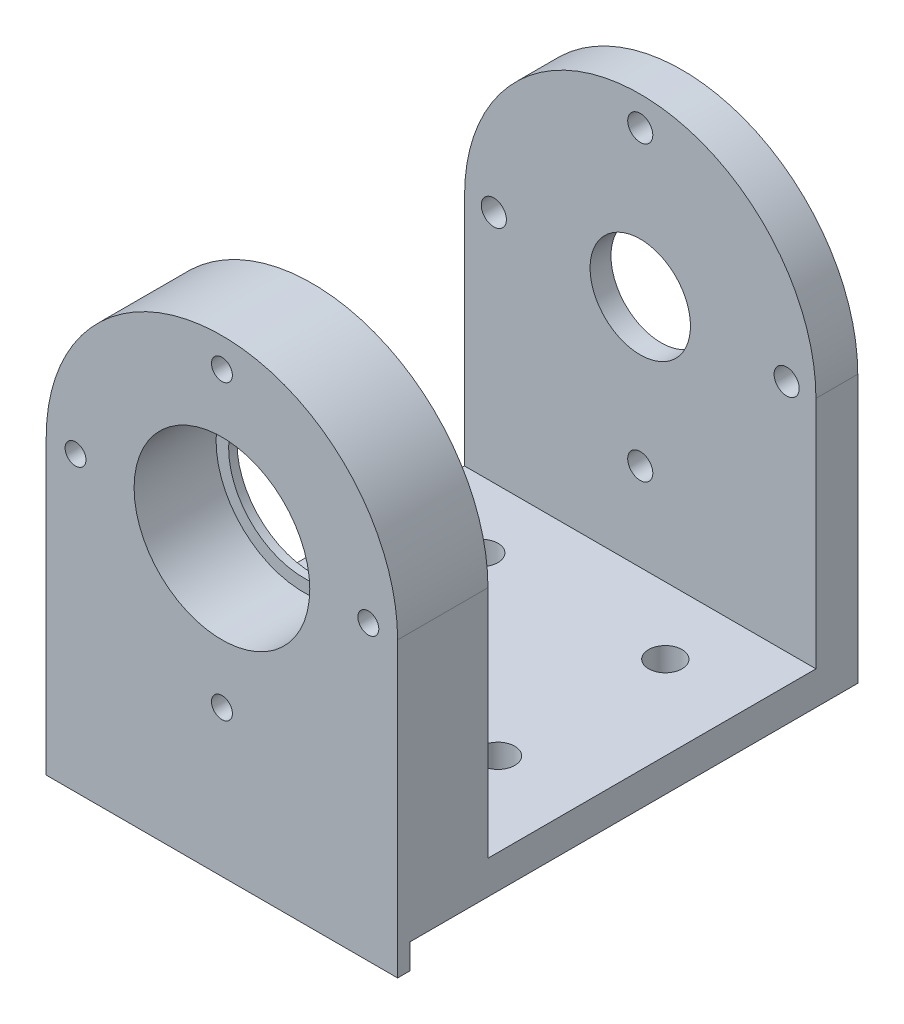
ISO-10303-21;
HEADER;
FILE_DESCRIPTION(('STEP AP214'),'2;1');
FILE_NAME('part.step','',(''),(''),'','','');
FILE_SCHEMA(('AUTOMOTIVE_DESIGN { 1 0 10303 214 1 1 1 1 }'));
ENDSEC;
DATA;
#1=APPLICATION_CONTEXT('core data for automotive mechanical design processes');
#2=APPLICATION_PROTOCOL_DEFINITION('international standard','automotive_design',2000,#1);
#3=PRODUCT_CONTEXT('',#1,'mechanical');
#4=PRODUCT('Part','Part','',(#3));
#5=PRODUCT_RELATED_PRODUCT_CATEGORY('part','',(#4));
#6=PRODUCT_DEFINITION_FORMATION('','',#4);
#7=PRODUCT_DEFINITION_CONTEXT('part definition',#1,'design');
#8=PRODUCT_DEFINITION('design','',#6,#7);
#9=PRODUCT_DEFINITION_SHAPE('','',#8);
#10=(LENGTH_UNIT() NAMED_UNIT(*) SI_UNIT(.MILLI.,.METRE.));
#11=(NAMED_UNIT(*) PLANE_ANGLE_UNIT() SI_UNIT($,.RADIAN.));
#12=(NAMED_UNIT(*) SI_UNIT($,.STERADIAN.) SOLID_ANGLE_UNIT());
#13=UNCERTAINTY_MEASURE_WITH_UNIT(LENGTH_MEASURE(1.E-05),#10,'distance_accuracy_value','');
#14=(GEOMETRIC_REPRESENTATION_CONTEXT(3) GLOBAL_UNCERTAINTY_ASSIGNED_CONTEXT((#13)) GLOBAL_UNIT_ASSIGNED_CONTEXT((#10,
#11,#12)) REPRESENTATION_CONTEXT('',''));
#15=CARTESIAN_POINT('',(0.,0.,0.));
#16=DIRECTION('',(0.,0.,1.));
#17=DIRECTION('',(1.,0.,0.));
#18=AXIS2_PLACEMENT_3D('',#15,#16,#17);
#19=CARTESIAN_POINT('',(0.,0.,-9.8));
#20=DIRECTION('',(0.,0.,-1.));
#21=DIRECTION('',(-1.,0.,0.));
#22=AXIS2_PLACEMENT_3D('',#19,#20,#21);
#23=PLANE('',#22);
#24=CARTESIAN_POINT('',(0.,0.,-9.8));
#25=DIRECTION('',(0.,0.,1.));
#26=DIRECTION('',(1.,0.,0.));
#27=AXIS2_PLACEMENT_3D('',#24,#25,#26);
#28=CIRCLE('',#27,10.5);
#29=CARTESIAN_POINT('',(10.5,0.,-9.8));
#30=VERTEX_POINT('',#29);
#31=EDGE_CURVE('E21',#30,#30,#28,.T.);
#32=ORIENTED_EDGE('',*,*,#31,.T.);
#33=EDGE_LOOP('',(#32));
#34=FACE_BOUND('',#33,.T.);
#35=CARTESIAN_POINT('',(0.,0.,-9.8));
#36=DIRECTION('',(0.,0.,-1.));
#37=DIRECTION('',(-1.,0.,0.));
#38=AXIS2_PLACEMENT_3D('',#35,#36,#37);
#39=CIRCLE('',#38,9.);
#40=CARTESIAN_POINT('',(-9.,0.,-9.8));
#41=VERTEX_POINT('',#40);
#42=EDGE_CURVE('E274',#41,#41,#39,.T.);
#43=ORIENTED_EDGE('',*,*,#42,.T.);
#44=EDGE_LOOP('',(#43));
#45=FACE_BOUND('',#44,.T.);
#46=ADVANCED_FACE('F18',(#34,#45),#23,.F.);
#47=CARTESIAN_POINT('',(0.,0.,-45.));
#48=DIRECTION('',(0.,0.,-1.));
#49=DIRECTION('',(-1.,0.,0.));
#50=AXIS2_PLACEMENT_3D('',#47,#48,#49);
#51=CYLINDRICAL_SURFACE('',#50,6.);
#52=CARTESIAN_POINT('',(0.,0.,-50.));
#53=DIRECTION('',(0.,0.,-1.));
#54=DIRECTION('',(-1.,0.,0.));
#55=AXIS2_PLACEMENT_3D('',#52,#53,#54);
#56=CIRCLE('',#55,6.);
#57=CARTESIAN_POINT('',(-6.,0.,-50.));
#58=VERTEX_POINT('',#57);
#59=EDGE_CURVE('E172',#58,#58,#56,.F.);
#60=ORIENTED_EDGE('',*,*,#59,.T.);
#61=EDGE_LOOP('',(#60));
#62=FACE_BOUND('',#61,.T.);
#63=CARTESIAN_POINT('',(0.,0.,-52.5));
#64=DIRECTION('',(0.,0.,-1.));
#65=DIRECTION('',(-1.,0.,0.));
#66=AXIS2_PLACEMENT_3D('',#63,#64,#65);
#67=CIRCLE('',#66,6.);
#68=CARTESIAN_POINT('',(-6.,0.,-52.5));
#69=VERTEX_POINT('',#68);
#70=EDGE_CURVE('E173',#69,#69,#67,.F.);
#71=ORIENTED_EDGE('',*,*,#70,.F.);
#72=EDGE_LOOP('',(#71));
#73=FACE_BOUND('',#72,.T.);
#74=ADVANCED_FACE('F285',(#62,#73),#51,.F.);
#75=CARTESIAN_POINT('',(0.,0.,-11.));
#76=DIRECTION('',(0.,0.,1.));
#77=DIRECTION('',(1.,0.,0.));
#78=AXIS2_PLACEMENT_3D('',#75,#76,#77);
#79=CYLINDRICAL_SURFACE('',#78,10.5);
#80=CARTESIAN_POINT('',(0.,0.,0.));
#81=DIRECTION('',(0.,0.,1.));
#82=DIRECTION('',(1.,0.,0.));
#83=AXIS2_PLACEMENT_3D('',#80,#81,#82);
#84=CIRCLE('',#83,10.5);
#85=CARTESIAN_POINT('',(10.5,0.,0.));
#86=VERTEX_POINT('',#85);
#87=EDGE_CURVE('E127',#86,#86,#84,.F.);
#88=ORIENTED_EDGE('',*,*,#87,.F.);
#89=EDGE_LOOP('',(#88));
#90=FACE_BOUND('',#89,.T.);
#91=ORIENTED_EDGE('',*,*,#31,.F.);
#92=EDGE_LOOP('',(#91));
#93=FACE_BOUND('',#92,.T.);
#94=ADVANCED_FACE('F282',(#90,#93),#79,.F.);
#95=CARTESIAN_POINT('',(0.,17.5,-10.8));
#96=DIRECTION('',(0.,0.,-1.));
#97=DIRECTION('',(-1.,0.,0.));
#98=AXIS2_PLACEMENT_3D('',#95,#96,#97);
#99=CYLINDRICAL_SURFACE('',#98,1.24999999999999);
#100=CARTESIAN_POINT('',(0.,17.5,0.));
#101=DIRECTION('',(0.,0.,-1.));
#102=DIRECTION('',(-1.,0.,0.));
#103=AXIS2_PLACEMENT_3D('',#100,#101,#102);
#104=CIRCLE('',#103,1.24999999999999);
#105=CARTESIAN_POINT('',(-1.24999999999999,17.5,0.));
#106=VERTEX_POINT('',#105);
#107=EDGE_CURVE('E268',#106,#106,#104,.T.);
#108=ORIENTED_EDGE('',*,*,#107,.F.);
#109=EDGE_LOOP('',(#108));
#110=FACE_BOUND('',#109,.T.);
#111=CARTESIAN_POINT('',(0.,17.5,-10.8));
#112=DIRECTION('',(0.,0.,-1.));
#113=DIRECTION('',(-1.,0.,0.));
#114=AXIS2_PLACEMENT_3D('',#111,#112,#113);
#115=CIRCLE('',#114,1.24999999999999);
#116=CARTESIAN_POINT('',(-1.24999999999999,17.5,-10.8));
#117=VERTEX_POINT('',#116);
#118=EDGE_CURVE('E100',#117,#117,#115,.T.);
#119=ORIENTED_EDGE('',*,*,#118,.T.);
#120=EDGE_LOOP('',(#119));
#121=FACE_BOUND('',#120,.T.);
#122=ADVANCED_FACE('F284',(#110,#121),#99,.F.);
#123=CARTESIAN_POINT('',(17.5,0.,-10.8));
#124=DIRECTION('',(0.,0.,-1.));
#125=DIRECTION('',(-1.,0.,0.));
#126=AXIS2_PLACEMENT_3D('',#123,#124,#125);
#127=CYLINDRICAL_SURFACE('',#126,1.24999999999999);
#128=CARTESIAN_POINT('',(17.5,0.,0.));
#129=DIRECTION('',(0.,0.,-1.));
#130=DIRECTION('',(-1.,0.,0.));
#131=AXIS2_PLACEMENT_3D('',#128,#129,#130);
#132=CIRCLE('',#131,1.24999999999999);
#133=CARTESIAN_POINT('',(16.25,0.,0.));
#134=VERTEX_POINT('',#133);
#135=EDGE_CURVE('E265',#134,#134,#132,.T.);
#136=ORIENTED_EDGE('',*,*,#135,.F.);
#137=EDGE_LOOP('',(#136));
#138=FACE_BOUND('',#137,.T.);
#139=CARTESIAN_POINT('',(17.5,0.,-10.8));
#140=DIRECTION('',(0.,0.,-1.));
#141=DIRECTION('',(-1.,0.,0.));
#142=AXIS2_PLACEMENT_3D('',#139,#140,#141);
#143=CIRCLE('',#142,1.24999999999999);
#144=CARTESIAN_POINT('',(16.25,0.,-10.8));
#145=VERTEX_POINT('',#144);
#146=EDGE_CURVE('E254',#145,#145,#143,.T.);
#147=ORIENTED_EDGE('',*,*,#146,.T.);
#148=EDGE_LOOP('',(#147));
#149=FACE_BOUND('',#148,.T.);
#150=ADVANCED_FACE('F293',(#138,#149),#127,.F.);
#151=CARTESIAN_POINT('',(-17.5,0.,-10.8));
#152=DIRECTION('',(0.,0.,-1.));
#153=DIRECTION('',(-1.,0.,0.));
#154=AXIS2_PLACEMENT_3D('',#151,#152,#153);
#155=CYLINDRICAL_SURFACE('',#154,1.24999999999999);
#156=CARTESIAN_POINT('',(-17.5,0.,0.));
#157=DIRECTION('',(0.,0.,-1.));
#158=DIRECTION('',(-1.,0.,0.));
#159=AXIS2_PLACEMENT_3D('',#156,#157,#158);
#160=CIRCLE('',#159,1.24999999999999);
#161=CARTESIAN_POINT('',(-18.75,0.,0.));
#162=VERTEX_POINT('',#161);
#163=EDGE_CURVE('E128',#162,#162,#160,.T.);
#164=ORIENTED_EDGE('',*,*,#163,.F.);
#165=EDGE_LOOP('',(#164));
#166=FACE_BOUND('',#165,.T.);
#167=CARTESIAN_POINT('',(-17.5,0.,-10.8));
#168=DIRECTION('',(0.,0.,-1.));
#169=DIRECTION('',(-1.,0.,0.));
#170=AXIS2_PLACEMENT_3D('',#167,#168,#169);
#171=CIRCLE('',#170,1.24999999999999);
#172=CARTESIAN_POINT('',(-18.75,0.,-10.8));
#173=VERTEX_POINT('',#172);
#174=EDGE_CURVE('E251',#173,#173,#171,.T.);
#175=ORIENTED_EDGE('',*,*,#174,.T.);
#176=EDGE_LOOP('',(#175));
#177=FACE_BOUND('',#176,.T.);
#178=ADVANCED_FACE('F393',(#166,#177),#155,.F.);
#179=CARTESIAN_POINT('',(0.,-17.5,-10.8));
#180=DIRECTION('',(0.,0.,-1.));
#181=DIRECTION('',(-1.,0.,0.));
#182=AXIS2_PLACEMENT_3D('',#179,#180,#181);
#183=CYLINDRICAL_SURFACE('',#182,1.24999999999999);
#184=CARTESIAN_POINT('',(0.,-17.5,0.));
#185=DIRECTION('',(0.,0.,-1.));
#186=DIRECTION('',(-1.,0.,0.));
#187=AXIS2_PLACEMENT_3D('',#184,#185,#186);
#188=CIRCLE('',#187,1.24999999999999);
#189=CARTESIAN_POINT('',(-1.24999999999999,-17.5,0.));
#190=VERTEX_POINT('',#189);
#191=EDGE_CURVE('E101',#190,#190,#188,.T.);
#192=ORIENTED_EDGE('',*,*,#191,.F.);
#193=EDGE_LOOP('',(#192));
#194=FACE_BOUND('',#193,.T.);
#195=CARTESIAN_POINT('',(0.,-17.5,-10.8));
#196=DIRECTION('',(0.,0.,-1.));
#197=DIRECTION('',(-1.,0.,0.));
#198=AXIS2_PLACEMENT_3D('',#195,#196,#197);
#199=CIRCLE('',#198,1.24999999999999);
#200=CARTESIAN_POINT('',(-1.24999999999999,-17.5,-10.8));
#201=VERTEX_POINT('',#200);
#202=EDGE_CURVE('E248',#201,#201,#199,.T.);
#203=ORIENTED_EDGE('',*,*,#202,.T.);
#204=EDGE_LOOP('',(#203));
#205=FACE_BOUND('',#204,.T.);
#206=ADVANCED_FACE('F389',(#194,#205),#183,.F.);
#207=CARTESIAN_POINT('',(0.,0.,-9.8));
#208=DIRECTION('',(0.,0.,-1.));
#209=DIRECTION('',(-1.,0.,0.));
#210=AXIS2_PLACEMENT_3D('',#207,#208,#209);
#211=CYLINDRICAL_SURFACE('',#210,9.);
#212=ORIENTED_EDGE('',*,*,#42,.F.);
#213=EDGE_LOOP('',(#212));
#214=FACE_BOUND('',#213,.T.);
#215=CARTESIAN_POINT('',(0.,0.,-10.8));
#216=DIRECTION('',(0.,0.,-1.));
#217=DIRECTION('',(-1.,0.,0.));
#218=AXIS2_PLACEMENT_3D('',#215,#216,#217);
#219=CIRCLE('',#218,9.);
#220=CARTESIAN_POINT('',(-9.,0.,-10.8));
#221=VERTEX_POINT('',#220);
#222=EDGE_CURVE('E244',#221,#221,#219,.T.);
#223=ORIENTED_EDGE('',*,*,#222,.T.);
#224=EDGE_LOOP('',(#223));
#225=FACE_BOUND('',#224,.T.);
#226=ADVANCED_FACE('F385',(#214,#225),#211,.F.);
#227=CARTESIAN_POINT('',(0.,0.,-52.5));
#228=DIRECTION('',(0.,0.,-1.));
#229=DIRECTION('',(-1.,0.,0.));
#230=AXIS2_PLACEMENT_3D('',#227,#228,#229);
#231=PLANE('',#230);
#232=ORIENTED_EDGE('',*,*,#70,.T.);
#233=EDGE_LOOP('',(#232));
#234=FACE_BOUND('',#233,.T.);
#235=CARTESIAN_POINT('',(0.,0.,-52.5));
#236=DIRECTION('',(0.,0.,-1.));
#237=DIRECTION('',(-1.,0.,0.));
#238=AXIS2_PLACEMENT_3D('',#235,#236,#237);
#239=CIRCLE('',#238,14.);
#240=CARTESIAN_POINT('',(-14.,0.,-52.5));
#241=VERTEX_POINT('',#240);
#242=EDGE_CURVE('E140',#241,#241,#239,.T.);
#243=ORIENTED_EDGE('',*,*,#242,.T.);
#244=EDGE_LOOP('',(#243));
#245=FACE_BOUND('',#244,.T.);
#246=ADVANCED_FACE('F381',(#234,#245),#231,.T.);
#247=CARTESIAN_POINT('',(-21.,-35.,-1.5));
#248=DIRECTION('',(0.,-1.,0.));
#249=DIRECTION('',(0.,0.,-1.));
#250=AXIS2_PLACEMENT_3D('',#247,#248,#249);
#251=PLANE('',#250);
#252=DIRECTION('',(1.,0.,0.));
#253=VECTOR('',#252,1.);
#254=CARTESIAN_POINT('',(0.,-35.,-1.5));
#255=LINE('',#254,#253);
#256=CARTESIAN_POINT('',(-21.,-35.,-1.5));
#257=VERTEX_POINT('',#256);
#258=CARTESIAN_POINT('',(21.,-35.,-1.5));
#259=VERTEX_POINT('',#258);
#260=EDGE_CURVE('E176',#257,#259,#255,.T.);
#261=ORIENTED_EDGE('',*,*,#260,.T.);
#262=DIRECTION('',(0.,0.,-1.));
#263=VECTOR('',#262,1.);
#264=CARTESIAN_POINT('',(21.,-35.,-55.));
#265=LINE('',#264,#263);
#266=CARTESIAN_POINT('',(21.,-35.,0.));
#267=VERTEX_POINT('',#266);
#268=EDGE_CURVE('E155',#267,#259,#265,.T.);
#269=ORIENTED_EDGE('',*,*,#268,.F.);
#270=DIRECTION('',(1.,0.,0.));
#271=VECTOR('',#270,1.);
#272=CARTESIAN_POINT('',(0.,-35.,0.));
#273=LINE('',#272,#271);
#274=CARTESIAN_POINT('',(-21.,-35.,0.));
#275=VERTEX_POINT('',#274);
#276=EDGE_CURVE('E125',#275,#267,#273,.T.);
#277=ORIENTED_EDGE('',*,*,#276,.F.);
#278=DIRECTION('',(0.,0.,-1.));
#279=VECTOR('',#278,1.);
#280=CARTESIAN_POINT('',(-21.,-35.,-1.5));
#281=LINE('',#280,#279);
#282=EDGE_CURVE('E113',#275,#257,#281,.T.);
#283=ORIENTED_EDGE('',*,*,#282,.T.);
#284=EDGE_LOOP('',(#261,#269,#277,#283));
#285=FACE_BOUND('',#284,.T.);
#286=ADVANCED_FACE('F377',(#285),#251,.T.);
#287=CARTESIAN_POINT('',(-21.,-28.,-50.));
#288=DIRECTION('',(0.,0.,-1.));
#289=DIRECTION('',(-1.,0.,0.));
#290=AXIS2_PLACEMENT_3D('',#287,#288,#289);
#291=PLANE('',#290);
#292=DIRECTION('',(0.,1.,0.));
#293=VECTOR('',#292,1.);
#294=CARTESIAN_POINT('',(-21.,0.,-50.));
#295=LINE('',#294,#293);
#296=CARTESIAN_POINT('',(-21.,-28.,-50.));
#297=VERTEX_POINT('',#296);
#298=CARTESIAN_POINT('',(-21.,0.,-50.));
#299=VERTEX_POINT('',#298);
#300=EDGE_CURVE('E131',#297,#299,#295,.T.);
#301=ORIENTED_EDGE('',*,*,#300,.F.);
#302=DIRECTION('',(1.,0.,0.));
#303=VECTOR('',#302,1.);
#304=CARTESIAN_POINT('',(0.,-28.,-50.));
#305=LINE('',#304,#303);
#306=CARTESIAN_POINT('',(21.,-28.,-50.));
#307=VERTEX_POINT('',#306);
#308=EDGE_CURVE('E137',#307,#297,#305,.F.);
#309=ORIENTED_EDGE('',*,*,#308,.F.);
#310=DIRECTION('',(0.,1.,0.));
#311=VECTOR('',#310,1.);
#312=CARTESIAN_POINT('',(21.,-32.,-50.));
#313=LINE('',#312,#311);
#314=CARTESIAN_POINT('',(21.,0.,-50.));
#315=VERTEX_POINT('',#314);
#316=EDGE_CURVE('E144',#315,#307,#313,.F.);
#317=ORIENTED_EDGE('',*,*,#316,.F.);
#318=CARTESIAN_POINT('',(0.,0.,-50.));
#319=DIRECTION('',(0.,0.,1.));
#320=DIRECTION('',(1.,0.,0.));
#321=AXIS2_PLACEMENT_3D('',#318,#319,#320);
#322=CIRCLE('',#321,21.);
#323=EDGE_CURVE('E227',#299,#315,#322,.F.);
#324=ORIENTED_EDGE('',*,*,#323,.F.);
#325=EDGE_LOOP('',(#301,#309,#317,#324));
#326=FACE_BOUND('',#325,.T.);
#327=ORIENTED_EDGE('',*,*,#59,.F.);
#328=EDGE_LOOP('',(#327));
#329=FACE_BOUND('',#328,.T.);
#330=CARTESIAN_POINT('',(0.,17.5,-50.));
#331=DIRECTION('',(0.,0.,-1.));
#332=DIRECTION('',(-1.,0.,0.));
#333=AXIS2_PLACEMENT_3D('',#330,#331,#332);
#334=CIRCLE('',#333,1.5);
#335=CARTESIAN_POINT('',(-1.5,17.5,-50.));
#336=VERTEX_POINT('',#335);
#337=EDGE_CURVE('E230',#336,#336,#334,.T.);
#338=ORIENTED_EDGE('',*,*,#337,.T.);
#339=EDGE_LOOP('',(#338));
#340=FACE_BOUND('',#339,.T.);
#341=CARTESIAN_POINT('',(-17.5000000000005,4.95236783133562E-13,-50.));
#342=DIRECTION('',(0.,0.,-1.));
#343=DIRECTION('',(-1.,0.,0.));
#344=AXIS2_PLACEMENT_3D('',#341,#342,#343);
#345=CIRCLE('',#344,1.50000000000039);
#346=CARTESIAN_POINT('',(-19.0000000000009,4.95236783133562E-13,-50.));
#347=VERTEX_POINT('',#346);
#348=EDGE_CURVE('E233',#347,#347,#345,.T.);
#349=ORIENTED_EDGE('',*,*,#348,.T.);
#350=EDGE_LOOP('',(#349));
#351=FACE_BOUND('',#350,.T.);
#352=CARTESIAN_POINT('',(-9.90473566267125E-13,-17.5,-50.));
#353=DIRECTION('',(0.,0.,-1.));
#354=DIRECTION('',(-1.,0.,0.));
#355=AXIS2_PLACEMENT_3D('',#352,#353,#354);
#356=CIRCLE('',#355,1.50000000000107);
#357=CARTESIAN_POINT('',(-1.50000000000206,-17.5,-50.));
#358=VERTEX_POINT('',#357);
#359=EDGE_CURVE('E236',#358,#358,#356,.T.);
#360=ORIENTED_EDGE('',*,*,#359,.T.);
#361=EDGE_LOOP('',(#360));
#362=FACE_BOUND('',#361,.T.);
#363=CARTESIAN_POINT('',(17.4999999999995,-4.9737991503207E-13,-50.));
#364=DIRECTION('',(0.,0.,-1.));
#365=DIRECTION('',(-1.,0.,0.));
#366=AXIS2_PLACEMENT_3D('',#363,#364,#365);
#367=CIRCLE('',#366,1.5000000000008);
#368=CARTESIAN_POINT('',(15.9999999999987,-4.9737991503207E-13,-50.));
#369=VERTEX_POINT('',#368);
#370=EDGE_CURVE('E239',#369,#369,#367,.T.);
#371=ORIENTED_EDGE('',*,*,#370,.T.);
#372=EDGE_LOOP('',(#371));
#373=FACE_BOUND('',#372,.T.);
#374=ADVANCED_FACE('F373',(#326,#329,#340,#351,#362,#373),#291,.F.);
#375=CARTESIAN_POINT('',(0.,0.,0.));
#376=DIRECTION('',(0.,0.,1.));
#377=DIRECTION('',(1.,0.,0.));
#378=AXIS2_PLACEMENT_3D('',#375,#376,#377);
#379=PLANE('',#378);
#380=ORIENTED_EDGE('',*,*,#191,.T.);
#381=EDGE_LOOP('',(#380));
#382=FACE_BOUND('',#381,.T.);
#383=ORIENTED_EDGE('',*,*,#87,.T.);
#384=EDGE_LOOP('',(#383));
#385=FACE_BOUND('',#384,.T.);
#386=ORIENTED_EDGE('',*,*,#276,.T.);
#387=DIRECTION('',(0.,1.,0.));
#388=VECTOR('',#387,1.);
#389=CARTESIAN_POINT('',(21.,-32.,0.));
#390=LINE('',#389,#388);
#391=CARTESIAN_POINT('',(21.,0.,0.));
#392=VERTEX_POINT('',#391);
#393=EDGE_CURVE('E96',#392,#267,#390,.F.);
#394=ORIENTED_EDGE('',*,*,#393,.F.);
#395=CARTESIAN_POINT('',(0.,0.,0.));
#396=DIRECTION('',(0.,0.,1.));
#397=DIRECTION('',(1.,0.,0.));
#398=AXIS2_PLACEMENT_3D('',#395,#396,#397);
#399=CIRCLE('',#398,21.);
#400=CARTESIAN_POINT('',(-21.,0.,0.));
#401=VERTEX_POINT('',#400);
#402=EDGE_CURVE('E89',#401,#392,#399,.F.);
#403=ORIENTED_EDGE('',*,*,#402,.F.);
#404=DIRECTION('',(0.,1.,0.));
#405=VECTOR('',#404,1.);
#406=CARTESIAN_POINT('',(-21.,0.,0.));
#407=LINE('',#406,#405);
#408=EDGE_CURVE('E94',#275,#401,#407,.T.);
#409=ORIENTED_EDGE('',*,*,#408,.F.);
#410=EDGE_LOOP('',(#386,#394,#403,#409));
#411=FACE_BOUND('',#410,.T.);
#412=ORIENTED_EDGE('',*,*,#163,.T.);
#413=EDGE_LOOP('',(#412));
#414=FACE_BOUND('',#413,.T.);
#415=ORIENTED_EDGE('',*,*,#135,.T.);
#416=EDGE_LOOP('',(#415));
#417=FACE_BOUND('',#416,.T.);
#418=ORIENTED_EDGE('',*,*,#107,.T.);
#419=EDGE_LOOP('',(#418));
#420=FACE_BOUND('',#419,.T.);
#421=ADVANCED_FACE('F91',(#382,#385,#411,#414,#417,#420),#379,.T.);
#422=CARTESIAN_POINT('',(0.,0.,-55.));
#423=DIRECTION('',(0.,0.,1.));
#424=DIRECTION('',(1.,0.,0.));
#425=AXIS2_PLACEMENT_3D('',#422,#423,#424);
#426=CYLINDRICAL_SURFACE('',#425,21.);
#427=ORIENTED_EDGE('',*,*,#402,.T.);
#428=DIRECTION('',(0.,0.,-1.));
#429=VECTOR('',#428,1.);
#430=CARTESIAN_POINT('',(21.,0.,-55.));
#431=LINE('',#430,#429);
#432=CARTESIAN_POINT('',(21.,0.,-10.8));
#433=VERTEX_POINT('',#432);
#434=EDGE_CURVE('E151',#433,#392,#431,.F.);
#435=ORIENTED_EDGE('',*,*,#434,.F.);
#436=CARTESIAN_POINT('',(0.,0.,-10.8));
#437=DIRECTION('',(0.,0.,1.));
#438=DIRECTION('',(1.,0.,0.));
#439=AXIS2_PLACEMENT_3D('',#436,#437,#438);
#440=CIRCLE('',#439,21.);
#441=CARTESIAN_POINT('',(-21.,0.,-10.8));
#442=VERTEX_POINT('',#441);
#443=EDGE_CURVE('E106',#433,#442,#440,.T.);
#444=ORIENTED_EDGE('',*,*,#443,.T.);
#445=DIRECTION('',(0.,0.,1.));
#446=VECTOR('',#445,1.);
#447=CARTESIAN_POINT('',(-21.,0.,-55.));
#448=LINE('',#447,#446);
#449=EDGE_CURVE('E104',#401,#442,#448,.F.);
#450=ORIENTED_EDGE('',*,*,#449,.F.);
#451=EDGE_LOOP('',(#427,#435,#444,#450));
#452=FACE_BOUND('',#451,.T.);
#453=ADVANCED_FACE('F105',(#452),#426,.T.);
#454=CARTESIAN_POINT('',(-21.,-28.,-10.8));
#455=DIRECTION('',(0.,0.,1.));
#456=DIRECTION('',(1.,0.,0.));
#457=AXIS2_PLACEMENT_3D('',#454,#455,#456);
#458=PLANE('',#457);
#459=ORIENTED_EDGE('',*,*,#222,.F.);
#460=EDGE_LOOP('',(#459));
#461=FACE_BOUND('',#460,.T.);
#462=DIRECTION('',(0.,1.,0.));
#463=VECTOR('',#462,1.);
#464=CARTESIAN_POINT('',(21.,-32.,-10.8));
#465=LINE('',#464,#463);
#466=CARTESIAN_POINT('',(21.,-28.,-10.8));
#467=VERTEX_POINT('',#466);
#468=EDGE_CURVE('E153',#467,#433,#465,.T.);
#469=ORIENTED_EDGE('',*,*,#468,.F.);
#470=DIRECTION('',(1.,0.,0.));
#471=VECTOR('',#470,1.);
#472=CARTESIAN_POINT('',(0.,-28.,-10.8));
#473=LINE('',#472,#471);
#474=CARTESIAN_POINT('',(-21.,-28.,-10.8));
#475=VERTEX_POINT('',#474);
#476=EDGE_CURVE('E141',#475,#467,#473,.T.);
#477=ORIENTED_EDGE('',*,*,#476,.F.);
#478=DIRECTION('',(0.,1.,0.));
#479=VECTOR('',#478,1.);
#480=CARTESIAN_POINT('',(-21.,0.,-10.8));
#481=LINE('',#480,#479);
#482=EDGE_CURVE('E109',#442,#475,#481,.F.);
#483=ORIENTED_EDGE('',*,*,#482,.F.);
#484=ORIENTED_EDGE('',*,*,#443,.F.);
#485=EDGE_LOOP('',(#469,#477,#483,#484));
#486=FACE_BOUND('',#485,.T.);
#487=ORIENTED_EDGE('',*,*,#202,.F.);
#488=EDGE_LOOP('',(#487));
#489=FACE_BOUND('',#488,.T.);
#490=ORIENTED_EDGE('',*,*,#174,.F.);
#491=EDGE_LOOP('',(#490));
#492=FACE_BOUND('',#491,.T.);
#493=ORIENTED_EDGE('',*,*,#146,.F.);
#494=EDGE_LOOP('',(#493));
#495=FACE_BOUND('',#494,.T.);
#496=ORIENTED_EDGE('',*,*,#118,.F.);
#497=EDGE_LOOP('',(#496));
#498=FACE_BOUND('',#497,.T.);
#499=ADVANCED_FACE('F364',(#461,#486,#489,#492,#495,#498),#458,.F.);
#500=CARTESIAN_POINT('',(0.,-28.,0.));
#501=DIRECTION('',(0.,1.,0.));
#502=DIRECTION('',(0.,0.,1.));
#503=AXIS2_PLACEMENT_3D('',#500,#501,#502);
#504=PLANE('',#503);
#505=DIRECTION('',(0.,0.,-1.));
#506=VECTOR('',#505,1.);
#507=CARTESIAN_POINT('',(21.,-28.,-55.));
#508=LINE('',#507,#506);
#509=EDGE_CURVE('E147',#307,#467,#508,.F.);
#510=ORIENTED_EDGE('',*,*,#509,.F.);
#511=ORIENTED_EDGE('',*,*,#308,.T.);
#512=DIRECTION('',(0.,0.,1.));
#513=VECTOR('',#512,1.);
#514=CARTESIAN_POINT('',(-21.,-28.,-55.));
#515=LINE('',#514,#513);
#516=EDGE_CURVE('E215',#475,#297,#515,.F.);
#517=ORIENTED_EDGE('',*,*,#516,.F.);
#518=ORIENTED_EDGE('',*,*,#476,.T.);
#519=EDGE_LOOP('',(#510,#511,#517,#518));
#520=FACE_BOUND('',#519,.T.);
#521=CARTESIAN_POINT('',(-11.,-28.,-22.));
#522=DIRECTION('',(0.,1.,0.));
#523=DIRECTION('',(0.,0.,1.));
#524=AXIS2_PLACEMENT_3D('',#521,#522,#523);
#525=CIRCLE('',#524,2.);
#526=CARTESIAN_POINT('',(-11.,-28.,-20.));
#527=VERTEX_POINT('',#526);
#528=EDGE_CURVE('E148',#527,#527,#525,.F.);
#529=ORIENTED_EDGE('',*,*,#528,.T.);
#530=EDGE_LOOP('',(#529));
#531=FACE_BOUND('',#530,.T.);
#532=CARTESIAN_POINT('',(11.,-28.,-22.));
#533=DIRECTION('',(0.,1.,0.));
#534=DIRECTION('',(0.,0.,1.));
#535=AXIS2_PLACEMENT_3D('',#532,#533,#534);
#536=CIRCLE('',#535,2.);
#537=CARTESIAN_POINT('',(11.,-28.,-20.));
#538=VERTEX_POINT('',#537);
#539=EDGE_CURVE('E218',#538,#538,#536,.F.);
#540=ORIENTED_EDGE('',*,*,#539,.T.);
#541=EDGE_LOOP('',(#540));
#542=FACE_BOUND('',#541,.T.);
#543=CARTESIAN_POINT('',(11.,-28.,-42.));
#544=DIRECTION('',(0.,1.,0.));
#545=DIRECTION('',(0.,0.,1.));
#546=AXIS2_PLACEMENT_3D('',#543,#544,#545);
#547=CIRCLE('',#546,2.);
#548=CARTESIAN_POINT('',(11.,-28.,-40.));
#549=VERTEX_POINT('',#548);
#550=EDGE_CURVE('E221',#549,#549,#547,.F.);
#551=ORIENTED_EDGE('',*,*,#550,.T.);
#552=EDGE_LOOP('',(#551));
#553=FACE_BOUND('',#552,.T.);
#554=CARTESIAN_POINT('',(-11.,-28.,-42.));
#555=DIRECTION('',(0.,1.,0.));
#556=DIRECTION('',(0.,0.,1.));
#557=AXIS2_PLACEMENT_3D('',#554,#555,#556);
#558=CIRCLE('',#557,2.);
#559=CARTESIAN_POINT('',(-11.,-28.,-40.));
#560=VERTEX_POINT('',#559);
#561=EDGE_CURVE('E224',#560,#560,#558,.F.);
#562=ORIENTED_EDGE('',*,*,#561,.T.);
#563=EDGE_LOOP('',(#562));
#564=FACE_BOUND('',#563,.T.);
#565=ADVANCED_FACE('F360',(#520,#531,#542,#553,#564),#504,.T.);
#566=CARTESIAN_POINT('',(0.,0.,-52.5));
#567=DIRECTION('',(0.,0.,-1.));
#568=DIRECTION('',(-1.,0.,0.));
#569=AXIS2_PLACEMENT_3D('',#566,#567,#568);
#570=CYLINDRICAL_SURFACE('',#569,14.);
#571=ORIENTED_EDGE('',*,*,#242,.F.);
#572=EDGE_LOOP('',(#571));
#573=FACE_BOUND('',#572,.T.);
#574=CARTESIAN_POINT('',(0.,0.,-55.));
#575=DIRECTION('',(0.,0.,-1.));
#576=DIRECTION('',(-1.,0.,0.));
#577=AXIS2_PLACEMENT_3D('',#574,#575,#576);
#578=CIRCLE('',#577,14.);
#579=CARTESIAN_POINT('',(-14.,0.,-55.));
#580=VERTEX_POINT('',#579);
#581=EDGE_CURVE('E212',#580,#580,#578,.T.);
#582=ORIENTED_EDGE('',*,*,#581,.T.);
#583=EDGE_LOOP('',(#582));
#584=FACE_BOUND('',#583,.T.);
#585=ADVANCED_FACE('F356',(#573,#584),#570,.F.);
#586=CARTESIAN_POINT('',(17.4999999999995,-4.9737991503207E-13,-45.));
#587=DIRECTION('',(0.,0.,-1.));
#588=DIRECTION('',(-1.,0.,0.));
#589=AXIS2_PLACEMENT_3D('',#586,#587,#588);
#590=CYLINDRICAL_SURFACE('',#589,1.5000000000008);
#591=ORIENTED_EDGE('',*,*,#370,.F.);
#592=EDGE_LOOP('',(#591));
#593=FACE_BOUND('',#592,.T.);
#594=CARTESIAN_POINT('',(17.4999999999995,-4.9737991503207E-13,-55.));
#595=DIRECTION('',(0.,0.,-1.));
#596=DIRECTION('',(-1.,0.,0.));
#597=AXIS2_PLACEMENT_3D('',#594,#595,#596);
#598=CIRCLE('',#597,1.5000000000008);
#599=CARTESIAN_POINT('',(15.9999999999987,-4.9737991503207E-13,-55.));
#600=VERTEX_POINT('',#599);
#601=EDGE_CURVE('E209',#600,#600,#598,.T.);
#602=ORIENTED_EDGE('',*,*,#601,.T.);
#603=EDGE_LOOP('',(#602));
#604=FACE_BOUND('',#603,.T.);
#605=ADVANCED_FACE('F352',(#593,#604),#590,.F.);
#606=CARTESIAN_POINT('',(-9.90473566267125E-13,-17.5,-45.));
#607=DIRECTION('',(0.,0.,-1.));
#608=DIRECTION('',(-1.,0.,0.));
#609=AXIS2_PLACEMENT_3D('',#606,#607,#608);
#610=CYLINDRICAL_SURFACE('',#609,1.50000000000107);
#611=ORIENTED_EDGE('',*,*,#359,.F.);
#612=EDGE_LOOP('',(#611));
#613=FACE_BOUND('',#612,.T.);
#614=CARTESIAN_POINT('',(-9.90473566267125E-13,-17.5,-55.));
#615=DIRECTION('',(0.,0.,-1.));
#616=DIRECTION('',(-1.,0.,0.));
#617=AXIS2_PLACEMENT_3D('',#614,#615,#616);
#618=CIRCLE('',#617,1.50000000000107);
#619=CARTESIAN_POINT('',(-1.50000000000206,-17.5,-55.));
#620=VERTEX_POINT('',#619);
#621=EDGE_CURVE('E206',#620,#620,#618,.T.);
#622=ORIENTED_EDGE('',*,*,#621,.T.);
#623=EDGE_LOOP('',(#622));
#624=FACE_BOUND('',#623,.T.);
#625=ADVANCED_FACE('F348',(#613,#624),#610,.F.);
#626=CARTESIAN_POINT('',(-17.5000000000005,4.95236783133562E-13,-45.));
#627=DIRECTION('',(0.,0.,-1.));
#628=DIRECTION('',(-1.,0.,0.));
#629=AXIS2_PLACEMENT_3D('',#626,#627,#628);
#630=CYLINDRICAL_SURFACE('',#629,1.50000000000039);
#631=ORIENTED_EDGE('',*,*,#348,.F.);
#632=EDGE_LOOP('',(#631));
#633=FACE_BOUND('',#632,.T.);
#634=CARTESIAN_POINT('',(-17.5000000000005,4.95236783133562E-13,-55.));
#635=DIRECTION('',(0.,0.,-1.));
#636=DIRECTION('',(-1.,0.,0.));
#637=AXIS2_PLACEMENT_3D('',#634,#635,#636);
#638=CIRCLE('',#637,1.50000000000039);
#639=CARTESIAN_POINT('',(-19.0000000000009,4.95236783133562E-13,-55.));
#640=VERTEX_POINT('',#639);
#641=EDGE_CURVE('E203',#640,#640,#638,.T.);
#642=ORIENTED_EDGE('',*,*,#641,.T.);
#643=EDGE_LOOP('',(#642));
#644=FACE_BOUND('',#643,.T.);
#645=ADVANCED_FACE('F344',(#633,#644),#630,.F.);
#646=CARTESIAN_POINT('',(0.,17.5,-45.));
#647=DIRECTION('',(0.,0.,-1.));
#648=DIRECTION('',(-1.,0.,0.));
#649=AXIS2_PLACEMENT_3D('',#646,#647,#648);
#650=CYLINDRICAL_SURFACE('',#649,1.5);
#651=ORIENTED_EDGE('',*,*,#337,.F.);
#652=EDGE_LOOP('',(#651));
#653=FACE_BOUND('',#652,.T.);
#654=CARTESIAN_POINT('',(0.,17.5,-55.));
#655=DIRECTION('',(0.,0.,-1.));
#656=DIRECTION('',(-1.,0.,0.));
#657=AXIS2_PLACEMENT_3D('',#654,#655,#656);
#658=CIRCLE('',#657,1.5);
#659=CARTESIAN_POINT('',(-1.5,17.5,-55.));
#660=VERTEX_POINT('',#659);
#661=EDGE_CURVE('E200',#660,#660,#658,.T.);
#662=ORIENTED_EDGE('',*,*,#661,.T.);
#663=EDGE_LOOP('',(#662));
#664=FACE_BOUND('',#663,.T.);
#665=ADVANCED_FACE('F340',(#653,#664),#650,.F.);
#666=CARTESIAN_POINT('',(0.,0.,-55.));
#667=DIRECTION('',(0.,0.,1.));
#668=DIRECTION('',(1.,0.,0.));
#669=AXIS2_PLACEMENT_3D('',#666,#667,#668);
#670=CYLINDRICAL_SURFACE('',#669,21.);
#671=CARTESIAN_POINT('',(0.,0.,-55.));
#672=DIRECTION('',(0.,0.,1.));
#673=DIRECTION('',(1.,0.,0.));
#674=AXIS2_PLACEMENT_3D('',#671,#672,#673);
#675=CIRCLE('',#674,21.);
#676=CARTESIAN_POINT('',(21.,0.,-55.));
#677=VERTEX_POINT('',#676);
#678=CARTESIAN_POINT('',(-21.,0.,-55.));
#679=VERTEX_POINT('',#678);
#680=EDGE_CURVE('E196',#677,#679,#675,.T.);
#681=ORIENTED_EDGE('',*,*,#680,.T.);
#682=DIRECTION('',(0.,0.,1.));
#683=VECTOR('',#682,1.);
#684=CARTESIAN_POINT('',(-21.,0.,-55.));
#685=LINE('',#684,#683);
#686=EDGE_CURVE('E117',#299,#679,#685,.F.);
#687=ORIENTED_EDGE('',*,*,#686,.F.);
#688=ORIENTED_EDGE('',*,*,#323,.T.);
#689=DIRECTION('',(0.,0.,-1.));
#690=VECTOR('',#689,1.);
#691=CARTESIAN_POINT('',(21.,0.,-55.));
#692=LINE('',#691,#690);
#693=EDGE_CURVE('E160',#677,#315,#692,.F.);
#694=ORIENTED_EDGE('',*,*,#693,.F.);
#695=EDGE_LOOP('',(#681,#687,#688,#694));
#696=FACE_BOUND('',#695,.T.);
#697=ADVANCED_FACE('F336',(#696),#670,.T.);
#698=CARTESIAN_POINT('',(-11.,-35.,-42.));
#699=DIRECTION('',(0.,1.,0.));
#700=DIRECTION('',(0.,0.,1.));
#701=AXIS2_PLACEMENT_3D('',#698,#699,#700);
#702=CYLINDRICAL_SURFACE('',#701,2.);
#703=CARTESIAN_POINT('',(-11.,-32.,-42.));
#704=DIRECTION('',(0.,1.,0.));
#705=DIRECTION('',(0.,0.,1.));
#706=AXIS2_PLACEMENT_3D('',#703,#704,#705);
#707=CIRCLE('',#706,2.);
#708=CARTESIAN_POINT('',(-11.,-32.,-40.));
#709=VERTEX_POINT('',#708);
#710=EDGE_CURVE('E193',#709,#709,#707,.T.);
#711=ORIENTED_EDGE('',*,*,#710,.F.);
#712=EDGE_LOOP('',(#711));
#713=FACE_BOUND('',#712,.T.);
#714=ORIENTED_EDGE('',*,*,#561,.F.);
#715=EDGE_LOOP('',(#714));
#716=FACE_BOUND('',#715,.T.);
#717=ADVANCED_FACE('F332',(#713,#716),#702,.F.);
#718=CARTESIAN_POINT('',(11.,-35.,-42.));
#719=DIRECTION('',(0.,1.,0.));
#720=DIRECTION('',(0.,0.,1.));
#721=AXIS2_PLACEMENT_3D('',#718,#719,#720);
#722=CYLINDRICAL_SURFACE('',#721,2.);
#723=CARTESIAN_POINT('',(11.,-32.,-42.));
#724=DIRECTION('',(0.,1.,0.));
#725=DIRECTION('',(0.,0.,1.));
#726=AXIS2_PLACEMENT_3D('',#723,#724,#725);
#727=CIRCLE('',#726,2.);
#728=CARTESIAN_POINT('',(11.,-32.,-40.));
#729=VERTEX_POINT('',#728);
#730=EDGE_CURVE('E190',#729,#729,#727,.T.);
#731=ORIENTED_EDGE('',*,*,#730,.F.);
#732=EDGE_LOOP('',(#731));
#733=FACE_BOUND('',#732,.T.);
#734=ORIENTED_EDGE('',*,*,#550,.F.);
#735=EDGE_LOOP('',(#734));
#736=FACE_BOUND('',#735,.T.);
#737=ADVANCED_FACE('F328',(#733,#736),#722,.F.);
#738=CARTESIAN_POINT('',(11.,-35.,-22.));
#739=DIRECTION('',(0.,1.,0.));
#740=DIRECTION('',(0.,0.,1.));
#741=AXIS2_PLACEMENT_3D('',#738,#739,#740);
#742=CYLINDRICAL_SURFACE('',#741,2.);
#743=CARTESIAN_POINT('',(11.,-32.,-22.));
#744=DIRECTION('',(0.,1.,0.));
#745=DIRECTION('',(0.,0.,1.));
#746=AXIS2_PLACEMENT_3D('',#743,#744,#745);
#747=CIRCLE('',#746,2.);
#748=CARTESIAN_POINT('',(11.,-32.,-20.));
#749=VERTEX_POINT('',#748);
#750=EDGE_CURVE('E187',#749,#749,#747,.T.);
#751=ORIENTED_EDGE('',*,*,#750,.F.);
#752=EDGE_LOOP('',(#751));
#753=FACE_BOUND('',#752,.T.);
#754=ORIENTED_EDGE('',*,*,#539,.F.);
#755=EDGE_LOOP('',(#754));
#756=FACE_BOUND('',#755,.T.);
#757=ADVANCED_FACE('F324',(#753,#756),#742,.F.);
#758=CARTESIAN_POINT('',(-11.,-35.,-22.));
#759=DIRECTION('',(0.,1.,0.));
#760=DIRECTION('',(0.,0.,1.));
#761=AXIS2_PLACEMENT_3D('',#758,#759,#760);
#762=CYLINDRICAL_SURFACE('',#761,2.);
#763=CARTESIAN_POINT('',(-11.,-32.,-22.));
#764=DIRECTION('',(0.,1.,0.));
#765=DIRECTION('',(0.,0.,1.));
#766=AXIS2_PLACEMENT_3D('',#763,#764,#765);
#767=CIRCLE('',#766,2.);
#768=CARTESIAN_POINT('',(-11.,-32.,-20.));
#769=VERTEX_POINT('',#768);
#770=EDGE_CURVE('E183',#769,#769,#767,.T.);
#771=ORIENTED_EDGE('',*,*,#770,.F.);
#772=EDGE_LOOP('',(#771));
#773=FACE_BOUND('',#772,.T.);
#774=ORIENTED_EDGE('',*,*,#528,.F.);
#775=EDGE_LOOP('',(#774));
#776=FACE_BOUND('',#775,.T.);
#777=ADVANCED_FACE('F320',(#773,#776),#762,.F.);
#778=CARTESIAN_POINT('',(21.,-32.,-55.));
#779=DIRECTION('',(1.,0.,0.));
#780=DIRECTION('',(0.,0.,-1.));
#781=AXIS2_PLACEMENT_3D('',#778,#779,#780);
#782=PLANE('',#781);
#783=DIRECTION('',(0.,1.,0.));
#784=VECTOR('',#783,1.);
#785=CARTESIAN_POINT('',(21.,0.,-55.));
#786=LINE('',#785,#784);
#787=CARTESIAN_POINT('',(21.,-32.,-55.));
#788=VERTEX_POINT('',#787);
#789=EDGE_CURVE('E199',#788,#677,#786,.T.);
#790=ORIENTED_EDGE('',*,*,#789,.T.);
#791=ORIENTED_EDGE('',*,*,#693,.T.);
#792=ORIENTED_EDGE('',*,*,#316,.T.);
#793=ORIENTED_EDGE('',*,*,#509,.T.);
#794=ORIENTED_EDGE('',*,*,#468,.T.);
#795=ORIENTED_EDGE('',*,*,#434,.T.);
#796=ORIENTED_EDGE('',*,*,#393,.T.);
#797=ORIENTED_EDGE('',*,*,#268,.T.);
#798=DIRECTION('',(0.,1.,0.));
#799=VECTOR('',#798,1.);
#800=CARTESIAN_POINT('',(21.,0.,-1.5));
#801=LINE('',#800,#799);
#802=CARTESIAN_POINT('',(21.,-32.,-1.5));
#803=VERTEX_POINT('',#802);
#804=EDGE_CURVE('E134',#259,#803,#801,.T.);
#805=ORIENTED_EDGE('',*,*,#804,.T.);
#806=DIRECTION('',(0.,0.,-1.));
#807=VECTOR('',#806,1.);
#808=CARTESIAN_POINT('',(21.,-32.,-55.));
#809=LINE('',#808,#807);
#810=EDGE_CURVE('E186',#788,#803,#809,.F.);
#811=ORIENTED_EDGE('',*,*,#810,.F.);
#812=EDGE_LOOP('',(#790,#791,#792,#793,#794,#795,#796,#797,#805,#811));
#813=FACE_BOUND('',#812,.T.);
#814=ADVANCED_FACE('F316',(#813),#782,.T.);
#815=CARTESIAN_POINT('',(0.,0.,-1.5));
#816=DIRECTION('',(0.,0.,1.));
#817=DIRECTION('',(1.,0.,0.));
#818=AXIS2_PLACEMENT_3D('',#815,#816,#817);
#819=PLANE('',#818);
#820=DIRECTION('',(1.,0.,0.));
#821=VECTOR('',#820,1.);
#822=CARTESIAN_POINT('',(-21.,-32.,-1.5));
#823=LINE('',#822,#821);
#824=CARTESIAN_POINT('',(-21.,-32.,-1.5));
#825=VERTEX_POINT('',#824);
#826=EDGE_CURVE('E626',#803,#825,#823,.F.);
#827=ORIENTED_EDGE('',*,*,#826,.F.);
#828=ORIENTED_EDGE('',*,*,#804,.F.);
#829=ORIENTED_EDGE('',*,*,#260,.F.);
#830=DIRECTION('',(0.,1.,0.));
#831=VECTOR('',#830,1.);
#832=CARTESIAN_POINT('',(-21.,0.,-1.5));
#833=LINE('',#832,#831);
#834=EDGE_CURVE('E115',#825,#257,#833,.F.);
#835=ORIENTED_EDGE('',*,*,#834,.F.);
#836=EDGE_LOOP('',(#827,#828,#829,#835));
#837=FACE_BOUND('',#836,.T.);
#838=ADVANCED_FACE('F313',(#837),#819,.F.);
#839=CARTESIAN_POINT('',(-21.,0.,-55.));
#840=DIRECTION('',(-1.,0.,0.));
#841=DIRECTION('',(0.,0.,1.));
#842=AXIS2_PLACEMENT_3D('',#839,#840,#841);
#843=PLANE('',#842);
#844=ORIENTED_EDGE('',*,*,#482,.T.);
#845=ORIENTED_EDGE('',*,*,#516,.T.);
#846=ORIENTED_EDGE('',*,*,#300,.T.);
#847=ORIENTED_EDGE('',*,*,#686,.T.);
#848=DIRECTION('',(0.,1.,0.));
#849=VECTOR('',#848,1.);
#850=CARTESIAN_POINT('',(-21.,0.,-55.));
#851=LINE('',#850,#849);
#852=CARTESIAN_POINT('',(-21.,-32.,-55.));
#853=VERTEX_POINT('',#852);
#854=EDGE_CURVE('E36',#679,#853,#851,.F.);
#855=ORIENTED_EDGE('',*,*,#854,.T.);
#856=DIRECTION('',(0.,0.,-1.));
#857=VECTOR('',#856,1.);
#858=CARTESIAN_POINT('',(-21.,-32.,-55.));
#859=LINE('',#858,#857);
#860=EDGE_CURVE('E27',#825,#853,#859,.T.);
#861=ORIENTED_EDGE('',*,*,#860,.F.);
#862=ORIENTED_EDGE('',*,*,#834,.T.);
#863=ORIENTED_EDGE('',*,*,#282,.F.);
#864=ORIENTED_EDGE('',*,*,#408,.T.);
#865=ORIENTED_EDGE('',*,*,#449,.T.);
#866=EDGE_LOOP('',(#844,#845,#846,#847,#855,#861,#862,#863,#864,#865));
#867=FACE_BOUND('',#866,.T.);
#868=ADVANCED_FACE('F111',(#867),#843,.T.);
#869=CARTESIAN_POINT('',(0.,0.,-55.));
#870=DIRECTION('',(0.,0.,1.));
#871=DIRECTION('',(1.,0.,0.));
#872=AXIS2_PLACEMENT_3D('',#869,#870,#871);
#873=PLANE('',#872);
#874=ORIENTED_EDGE('',*,*,#789,.F.);
#875=DIRECTION('',(1.,0.,0.));
#876=VECTOR('',#875,1.);
#877=CARTESIAN_POINT('',(-21.,-32.,-55.));
#878=LINE('',#877,#876);
#879=EDGE_CURVE('E11',#853,#788,#878,.T.);
#880=ORIENTED_EDGE('',*,*,#879,.F.);
#881=ORIENTED_EDGE('',*,*,#854,.F.);
#882=ORIENTED_EDGE('',*,*,#680,.F.);
#883=EDGE_LOOP('',(#874,#880,#881,#882));
#884=FACE_BOUND('',#883,.T.);
#885=ORIENTED_EDGE('',*,*,#661,.F.);
#886=EDGE_LOOP('',(#885));
#887=FACE_BOUND('',#886,.T.);
#888=ORIENTED_EDGE('',*,*,#641,.F.);
#889=EDGE_LOOP('',(#888));
#890=FACE_BOUND('',#889,.T.);
#891=ORIENTED_EDGE('',*,*,#621,.F.);
#892=EDGE_LOOP('',(#891));
#893=FACE_BOUND('',#892,.T.);
#894=ORIENTED_EDGE('',*,*,#601,.F.);
#895=EDGE_LOOP('',(#894));
#896=FACE_BOUND('',#895,.T.);
#897=ORIENTED_EDGE('',*,*,#581,.F.);
#898=EDGE_LOOP('',(#897));
#899=FACE_BOUND('',#898,.T.);
#900=ADVANCED_FACE('F300',(#884,#887,#890,#893,#896,#899),#873,.F.);
#901=CARTESIAN_POINT('',(-21.,-32.,-55.));
#902=DIRECTION('',(0.,-1.,0.));
#903=DIRECTION('',(0.,0.,-1.));
#904=AXIS2_PLACEMENT_3D('',#901,#902,#903);
#905=PLANE('',#904);
#906=ORIENTED_EDGE('',*,*,#860,.T.);
#907=ORIENTED_EDGE('',*,*,#879,.T.);
#908=ORIENTED_EDGE('',*,*,#810,.T.);
#909=ORIENTED_EDGE('',*,*,#826,.T.);
#910=EDGE_LOOP('',(#906,#907,#908,#909));
#911=FACE_BOUND('',#910,.T.);
#912=ORIENTED_EDGE('',*,*,#770,.T.);
#913=EDGE_LOOP('',(#912));
#914=FACE_BOUND('',#913,.T.);
#915=ORIENTED_EDGE('',*,*,#750,.T.);
#916=EDGE_LOOP('',(#915));
#917=FACE_BOUND('',#916,.T.);
#918=ORIENTED_EDGE('',*,*,#730,.T.);
#919=EDGE_LOOP('',(#918));
#920=FACE_BOUND('',#919,.T.);
#921=ORIENTED_EDGE('',*,*,#710,.T.);
#922=EDGE_LOOP('',(#921));
#923=FACE_BOUND('',#922,.T.);
#924=ADVANCED_FACE('F298',(#911,#914,#917,#920,#923),#905,.T.);
#925=CLOSED_SHELL('',(#46,#74,#94,#122,#150,#178,#206,#226,#246,#286,#374,#421,#453,#499,#565,
#585,#605,#625,#645,#665,#697,#717,#737,#757,#777,#814,#838,#868,#900,#924));
#926=MANIFOLD_SOLID_BREP('B1',#925);
#927=ADVANCED_BREP_SHAPE_REPRESENTATION('',(#18,#926),#14);
#928=SHAPE_DEFINITION_REPRESENTATION(#9,#927);
ENDSEC;
END-ISO-10303-21;
